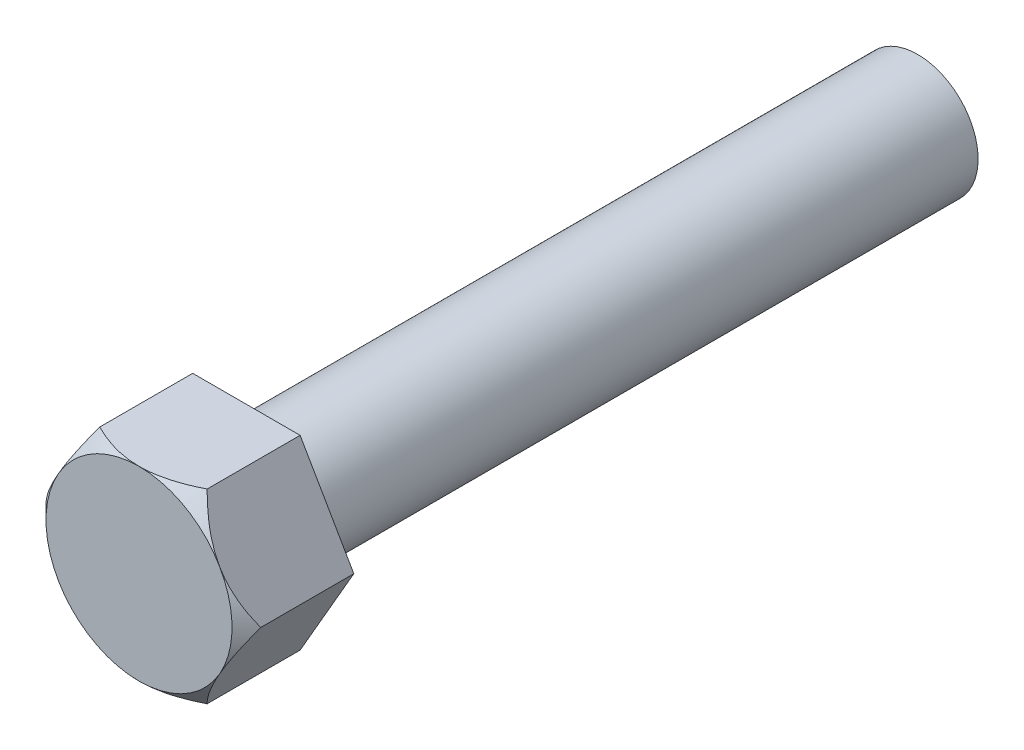
ISO-10303-21;
HEADER;
FILE_DESCRIPTION(('STEP AP214'),'2;1');
FILE_NAME('part.step','',(''),(''),'','','');
FILE_SCHEMA(('AUTOMOTIVE_DESIGN { 1 0 10303 214 1 1 1 1 }'));
ENDSEC;
DATA;
#1=APPLICATION_CONTEXT('core data for automotive mechanical design processes');
#2=APPLICATION_PROTOCOL_DEFINITION('international standard','automotive_design',2000,#1);
#3=PRODUCT_CONTEXT('',#1,'mechanical');
#4=PRODUCT('Part','Part','',(#3));
#5=PRODUCT_RELATED_PRODUCT_CATEGORY('part','',(#4));
#6=PRODUCT_DEFINITION_FORMATION('','',#4);
#7=PRODUCT_DEFINITION_CONTEXT('part definition',#1,'design');
#8=PRODUCT_DEFINITION('design','',#6,#7);
#9=PRODUCT_DEFINITION_SHAPE('','',#8);
#10=(LENGTH_UNIT() NAMED_UNIT(*) SI_UNIT(.MILLI.,.METRE.));
#11=(NAMED_UNIT(*) PLANE_ANGLE_UNIT() SI_UNIT($,.RADIAN.));
#12=(NAMED_UNIT(*) SI_UNIT($,.STERADIAN.) SOLID_ANGLE_UNIT());
#13=UNCERTAINTY_MEASURE_WITH_UNIT(LENGTH_MEASURE(1.E-05),#10,'distance_accuracy_value','');
#14=(GEOMETRIC_REPRESENTATION_CONTEXT(3) GLOBAL_UNCERTAINTY_ASSIGNED_CONTEXT((#13)) GLOBAL_UNIT_ASSIGNED_CONTEXT((#10,
#11,#12)) REPRESENTATION_CONTEXT('',''));
#15=CARTESIAN_POINT('',(0.,0.,0.));
#16=DIRECTION('',(0.,0.,1.));
#17=DIRECTION('',(1.,0.,0.));
#18=AXIS2_PLACEMENT_3D('',#15,#16,#17);
#19=CARTESIAN_POINT('',(2.,3.46410161513775,4.));
#20=DIRECTION('',(0.,-1.,0.));
#21=DIRECTION('',(1.,0.,0.));
#22=AXIS2_PLACEMENT_3D('',#19,#20,#21);
#23=PLANE('',#22);
#24=CARTESIAN_POINT('',(7.40017029938944,3.46410161513776,-0.7067319078246));
#25=CARTESIAN_POINT('',(7.18407004153921,3.46410161513776,-0.511073166536819));
#26=CARTESIAN_POINT('',(6.96725440490175,3.46410161513776,-0.316193765898289));
#27=CARTESIAN_POINT('',(6.53160584662028,3.46410161513776,0.0714200980872705));
#28=CARTESIAN_POINT('',(6.31277237006917,3.46410161513776,0.264153937166413));
#29=CARTESIAN_POINT('',(5.87066754506703,3.46410161513776,0.6484791114294));
#30=CARTESIAN_POINT('',(5.64737403972401,3.46410161513776,0.840045065272859));
#31=CARTESIAN_POINT('',(5.30994288032754,3.46410161513776,1.12439764508569));
#32=CARTESIAN_POINT('',(5.19706079108244,3.46410161513776,1.21867422432068));
#33=CARTESIAN_POINT('',(4.97031249767652,3.46410161513776,1.40605471643436));
#34=CARTESIAN_POINT('',(4.85644621873211,3.46410161513776,1.49915853885661));
#35=CARTESIAN_POINT('',(4.53999649672346,3.46410161513776,1.75469598186242));
#36=CARTESIAN_POINT('',(4.33621461524904,3.46410161513776,1.91565216408102));
#37=CARTESIAN_POINT('',(3.92400046507774,3.46410161513776,2.23149577635638));
#38=CARTESIAN_POINT('',(3.71556886523122,3.46410161513776,2.38638407054125));
#39=CARTESIAN_POINT('',(3.39836320090983,3.46410161513776,2.61194639730746));
#40=CARTESIAN_POINT('',(3.29195681902877,3.46410161513776,2.68594794027607));
#41=CARTESIAN_POINT('',(3.07730373985467,3.46410161513776,2.83122558710456));
#42=CARTESIAN_POINT('',(2.96905718028622,3.46410161513775,2.90250189364354));
#43=CARTESIAN_POINT('',(2.75048301211456,3.46410161513775,3.04165213772647));
#44=CARTESIAN_POINT('',(2.64015671724489,3.46410161513775,3.10952813020775));
#45=CARTESIAN_POINT('',(2.41703261399547,3.46410161513775,3.24107847098912));
#46=CARTESIAN_POINT('',(2.30423515776689,3.46410161513775,3.30475341283555));
#47=CARTESIAN_POINT('',(2.08144977638531,3.46410161513775,3.42380291248049));
#48=CARTESIAN_POINT('',(1.97159887598068,3.46410161513775,3.47943225146873));
#49=CARTESIAN_POINT('',(1.74903913634423,3.46410161513775,3.58472957387611));
#50=CARTESIAN_POINT('',(1.63633007395308,3.46410161513775,3.63439709006196));
#51=CARTESIAN_POINT('',(1.40812138349336,3.46410161513775,3.72619855255872));
#52=CARTESIAN_POINT('',(1.29262797307293,3.46410161513775,3.76834778651596));
#53=CARTESIAN_POINT('',(1.05871802930967,3.46410161513775,3.84351564840573));
#54=CARTESIAN_POINT('',(0.940302975318467,3.46410161513775,3.87653879794917));
#55=CARTESIAN_POINT('',(0.72121858836408,3.46410161513775,3.92704061908541));
#56=CARTESIAN_POINT('',(0.620940075769071,3.46410161513775,3.94620465981961));
#57=CARTESIAN_POINT('',(0.419133847203087,3.46410161513775,3.97616144972208));
#58=CARTESIAN_POINT('',(0.317606311496609,3.46410161513775,3.98695539282922));
#59=CARTESIAN_POINT('',(0.114121574983677,3.46410161513775,3.99960617914009));
#60=CARTESIAN_POINT('',(0.0121651103225236,3.46410161513775,4.00147469928641));
#61=CARTESIAN_POINT('',(-0.191515815212341,3.46410161513775,3.99620425968083));
#62=CARTESIAN_POINT('',(-0.293240265744337,3.46410161513775,3.9890649059828));
#63=CARTESIAN_POINT('',(-0.495218668791278,3.46410161513775,3.96621445225102));
#64=CARTESIAN_POINT('',(-0.595477303913389,3.46410161513775,3.95054410775051));
#65=CARTESIAN_POINT('',(-0.794465835445799,3.46410161513775,3.91140538195982));
#66=CARTESIAN_POINT('',(-0.893195344558054,3.46410161513775,3.88793505782806));
#67=CARTESIAN_POINT('',(-1.08897509907906,3.46410161513775,3.83409029574206));
#68=CARTESIAN_POINT('',(-1.18602099035489,3.46410161513775,3.80370019956214));
#69=CARTESIAN_POINT('',(-1.37804397268214,3.46410161513775,3.7370522437192));
#70=CARTESIAN_POINT('',(-1.47302124517933,3.46410161513775,3.70079490106373));
#71=CARTESIAN_POINT('',(-1.70872144754631,3.46410161513775,3.60365752890821));
#72=CARTESIAN_POINT('',(-1.84814535869977,3.46410161513775,3.53963253554078));
#73=CARTESIAN_POINT('',(-2.12278756270001,3.46410161513775,3.4030645583459));
#74=CARTESIAN_POINT('',(-2.25800324579788,3.46410161513775,3.33051641694664));
#75=CARTESIAN_POINT('',(-2.52505483460592,3.46410161513775,3.17880063044757));
#76=CARTESIAN_POINT('',(-2.6568821804044,3.46410161513775,3.09961803262705));
#77=CARTESIAN_POINT('',(-2.9173827558791,3.46410161513775,2.93631723185955));
#78=CARTESIAN_POINT('',(-3.04605663678762,3.46410161513775,2.85220006035422));
#79=CARTESIAN_POINT('',(-3.30204521029762,3.46410161513775,2.67928053371742));
#80=CARTESIAN_POINT('',(-3.42933422602434,3.46410161513775,2.59044034318988));
#81=CARTESIAN_POINT('',(-3.68170408721134,3.46410161513775,2.40967818295746));
#82=CARTESIAN_POINT('',(-3.80678484434625,3.46410161513775,2.31775609040783));
#83=CARTESIAN_POINT('',(-4.05493698412071,3.46410161513775,2.13157935310613));
#84=CARTESIAN_POINT('',(-4.17801078637578,3.46410161513775,2.03732792478451));
#85=CARTESIAN_POINT('',(-4.42261373513114,3.46410161513775,1.84683880788022));
#86=CARTESIAN_POINT('',(-4.5441428342403,3.46410161513775,1.75060105859423));
#87=CARTESIAN_POINT('',(-4.90254546348755,3.46410161513775,1.46286832216817));
#88=CARTESIAN_POINT('',(-5.13756354076296,3.46410161513775,1.26906294550104));
#89=CARTESIAN_POINT('',(-5.60402824417592,3.46410161513775,0.877051484386474));
#90=CARTESIAN_POINT('',(-5.8354734909006,3.46410161513775,0.678843768902327));
#91=CARTESIAN_POINT('',(-6.29027572717909,3.46410161513775,0.283909712167151));
#92=CARTESIAN_POINT('',(-6.513695740974,3.46410161513775,0.0872558324011803));
#93=CARTESIAN_POINT('',(-6.8472502917772,3.46410161513775,-0.209376727841603));
#94=CARTESIAN_POINT('',(-6.95814443399755,3.46410161513775,-0.308504002622919));
#95=CARTESIAN_POINT('',(-7.17948154981587,3.46410161513775,-0.507258863925652));
#96=CARTESIAN_POINT('',(-7.2899245278921,3.46410161513775,-0.606886445459024));
#97=CARTESIAN_POINT('',(-7.40017029938944,3.46410161513775,-0.706731907824598));
#98=B_SPLINE_CURVE_WITH_KNOTS('',3,(#24,#25,#26,#27,#28,#29,#30,#31,#32,#33,#34,#35,#36,#37,#38,
#39,#40,#41,#42,#43,#44,#45,#46,#47,#48,#49,#50,#51,#52,#53,#54,#55,#56,#57,#58,#59,#60,#61,#62,
#63,#64,#65,#66,#67,#68,#69,#70,#71,#72,#73,#74,#75,#76,#77,#78,#79,#80,#81,#82,#83,#84,#85,#86,
#87,#88,#89,#90,#91,#92,#93,#94,#95,#96,#97),.UNSPECIFIED.,.F.,.F.,(4,2,2,2,2,2,2,2,2,2,2,2,2,2,
2,2,2,2,2,2,2,2,2,2,2,2,2,2,2,2,2,2,2,2,2,2,4),(0.,0.87455680262504,1.74936174189804,
2.63194222676004,3.07315427435045,3.51440014741194,4.29336829879911,5.07222511103335,
5.46102045477179,5.84978682686765,6.23831534622729,6.62678885417829,6.99604619712695,
7.36533246023067,7.73385903857462,8.1022026979964,8.40816764102258,8.71408893214832,
9.01960988308062,9.32514419598646,9.62923151221206,9.93339462822948,10.2382529748776,
10.5430844727596,11.0029359662702,11.463067174876,11.9242648593344,12.385366483791,
12.8509867841538,13.3166256662762,13.7816540114968,14.2466965894055,15.1604736281341,
16.0745950566943,16.9674915730579,17.4137118923893,17.8599277717141),.UNSPECIFIED.);
#99=CARTESIAN_POINT('',(2.,3.46410161513775,3.46410161513776));
#100=VERTEX_POINT('',#99);
#101=CARTESIAN_POINT('',(0.,3.46410161513775,4.));
#102=VERTEX_POINT('',#101);
#103=EDGE_CURVE('E116',#100,#102,#98,.T.);
#104=ORIENTED_EDGE('',*,*,#103,.F.);
#105=DIRECTION('',(0.,0.,-1.));
#106=VECTOR('',#105,1.);
#107=CARTESIAN_POINT('',(2.,3.46410161513775,4.));
#108=LINE('',#107,#106);
#109=CARTESIAN_POINT('',(2.,3.46410161513775,0.));
#110=VERTEX_POINT('',#109);
#111=EDGE_CURVE('E65',#100,#110,#108,.T.);
#112=ORIENTED_EDGE('',*,*,#111,.T.);
#113=DIRECTION('',(-1.,0.,0.));
#114=VECTOR('',#113,1.);
#115=CARTESIAN_POINT('',(2.,3.46410161513775,0.));
#116=LINE('',#115,#114);
#117=CARTESIAN_POINT('',(-2.,3.46410161513775,0.));
#118=VERTEX_POINT('',#117);
#119=EDGE_CURVE('E124',#110,#118,#116,.T.);
#120=ORIENTED_EDGE('',*,*,#119,.T.);
#121=DIRECTION('',(0.,0.,-1.));
#122=VECTOR('',#121,1.);
#123=CARTESIAN_POINT('',(-2.,3.46410161513775,4.));
#124=LINE('',#123,#122);
#125=CARTESIAN_POINT('',(-2.,3.46410161513775,3.46410161513776));
#126=VERTEX_POINT('',#125);
#127=EDGE_CURVE('E142',#126,#118,#124,.T.);
#128=ORIENTED_EDGE('',*,*,#127,.F.);
#129=EDGE_CURVE('E125',#102,#126,#98,.T.);
#130=ORIENTED_EDGE('',*,*,#129,.F.);
#131=EDGE_LOOP('',(#104,#112,#120,#128,#130));
#132=FACE_BOUND('',#131,.T.);
#133=ADVANCED_FACE('F40',(#132),#23,.F.);
#134=CARTESIAN_POINT('',(-2.,3.46410161513775,4.));
#135=DIRECTION('',(0.866025403784439,-0.5,0.));
#136=DIRECTION('',(0.5,0.866025403784439,0.));
#137=AXIS2_PLACEMENT_3D('',#134,#135,#136);
#138=PLANE('',#137);
#139=CARTESIAN_POINT('',(-1.99988452994616,3.46430161513775,3.46398614008406));
#140=CARTESIAN_POINT('',(-2.06863246295732,3.34522670224709,3.53267400421884));
#141=CARTESIAN_POINT('',(-2.13852994001664,3.22416072065947,3.59732758690165));
#142=CARTESIAN_POINT('',(-2.28105847687455,2.97729405329311,3.71570650668545));
#143=CARTESIAN_POINT('',(-2.35370308985488,2.851469892715,3.76936598250564));
#144=CARTESIAN_POINT('',(-2.50018745024056,2.59775153801277,3.86128557885152));
#145=CARTESIAN_POINT('',(-2.57398989649517,2.46992195137692,3.89977672251399));
#146=CARTESIAN_POINT('',(-2.72321949203156,2.21144870991494,3.95908014460861));
#147=CARTESIAN_POINT('',(-2.79864208312694,2.08081295009925,3.97993668783239));
#148=CARTESIAN_POINT('',(-2.92863047900332,1.85566644404698,3.9987548867764));
#149=CARTESIAN_POINT('',(-2.98302842594063,1.76144643612412,4.0015404483458));
#150=CARTESIAN_POINT('',(-3.09173582960688,1.57315968981527,3.99684613324094));
#151=CARTESIAN_POINT('',(-3.14604524863371,1.47909301673127,3.98936265790477));
#152=CARTESIAN_POINT('',(-3.25414955803445,1.29185086033204,3.96455756349842));
#153=CARTESIAN_POINT('',(-3.30794380435859,1.19867649254374,3.94722494046805));
#154=CARTESIAN_POINT('',(-3.41460839868816,1.01392799579621,3.90366758974168));
#155=CARTESIAN_POINT('',(-3.46747881720154,0.922353744713608,3.87744354379729));
#156=CARTESIAN_POINT('',(-3.56133806063717,0.759784766323123,3.82348935231018));
#157=CARTESIAN_POINT('',(-3.60253465928436,0.688430164367164,3.79717760808617));
#158=CARTESIAN_POINT('',(-3.68418827514934,0.5470019530673,3.74031363756192));
#159=CARTESIAN_POINT('',(-3.72464526979475,0.476928382819914,3.7097612820838));
#160=CARTESIAN_POINT('',(-3.80469221784007,0.338283001814588,3.64510103437973));
#161=CARTESIAN_POINT('',(-3.84428444795005,0.269707247679151,3.61100432260174));
#162=CARTESIAN_POINT('',(-3.92273567790658,0.133825731478173,3.53970313630633));
#163=CARTESIAN_POINT('',(-3.96159510997834,0.0665192207766146,3.50250056877247));
#164=CARTESIAN_POINT('',(-4.00011547005384,-0.000200000000000289,3.46398614008406));
#165=B_SPLINE_CURVE_WITH_KNOTS('',3,(#139,#140,#141,#142,#143,#144,#145,#146,#147,#148,#149,
#150,#151,#152,#153,#154,#155,#156,#157,#158,#159,#160,#161,#162,#163,#164),.UNSPECIFIED.,.F.,
.F.,(4,2,2,2,2,2,2,2,2,2,2,2,4),(0.,0.461413976895459,0.925516105496516,1.38224785443131,
1.83782972377834,2.16386281017193,2.49001018016782,2.81652265677474,3.14301010363181,
3.40236585633197,3.66172951128433,3.92029851377053,4.17870990731807),.UNSPECIFIED.);
#166=CARTESIAN_POINT('',(-3.,1.73205080756888,4.));
#167=VERTEX_POINT('',#166);
#168=EDGE_CURVE('E131',#126,#167,#165,.T.);
#169=ORIENTED_EDGE('',*,*,#168,.F.);
#170=ORIENTED_EDGE('',*,*,#127,.T.);
#171=DIRECTION('',(-0.5,-0.866025403784439,0.));
#172=VECTOR('',#171,1.);
#173=CARTESIAN_POINT('',(-2.,3.46410161513775,0.));
#174=LINE('',#173,#172);
#175=CARTESIAN_POINT('',(-4.,0.,0.));
#176=VERTEX_POINT('',#175);
#177=EDGE_CURVE('E290',#118,#176,#174,.T.);
#178=ORIENTED_EDGE('',*,*,#177,.T.);
#179=DIRECTION('',(0.,0.,-1.));
#180=VECTOR('',#179,1.);
#181=CARTESIAN_POINT('',(-4.,0.,4.));
#182=LINE('',#181,#180);
#183=CARTESIAN_POINT('',(-4.,0.,3.46410161513776));
#184=VERTEX_POINT('',#183);
#185=EDGE_CURVE('E217',#184,#176,#182,.T.);
#186=ORIENTED_EDGE('',*,*,#185,.F.);
#187=EDGE_CURVE('E145',#167,#184,#165,.T.);
#188=ORIENTED_EDGE('',*,*,#187,.F.);
#189=EDGE_LOOP('',(#169,#170,#178,#186,#188));
#190=FACE_BOUND('',#189,.T.);
#191=ADVANCED_FACE('F205',(#190),#138,.F.);
#192=CARTESIAN_POINT('',(-4.,0.,4.));
#193=DIRECTION('',(0.866025403784439,0.5,0.));
#194=DIRECTION('',(-0.5,0.866025403784439,0.));
#195=AXIS2_PLACEMENT_3D('',#192,#193,#194);
#196=PLANE('',#195);
#197=CARTESIAN_POINT('',(-4.00011547005384,0.00019999999999938,3.46398614008406));
#198=CARTESIAN_POINT('',(-3.93136753704268,-0.118874912890663,3.53267400421884));
#199=CARTESIAN_POINT('',(-3.86147005998336,-0.239940894478287,3.59732758690165));
#200=CARTESIAN_POINT('',(-3.71894152312545,-0.486807561844643,3.71570650668545));
#201=CARTESIAN_POINT('',(-3.64629691014512,-0.612631722422753,3.76936598250564));
#202=CARTESIAN_POINT('',(-3.49981254975943,-0.866350077124988,3.86128557885152));
#203=CARTESIAN_POINT('',(-3.42601010350483,-0.994179663760835,3.89977672251399));
#204=CARTESIAN_POINT('',(-3.27678050796844,-1.25265290522282,3.95908014460861));
#205=CARTESIAN_POINT('',(-3.20135791687306,-1.38328866503851,3.97993668783239));
#206=CARTESIAN_POINT('',(-3.07136952099668,-1.60843517109077,3.9987548867764));
#207=CARTESIAN_POINT('',(-3.01697157405937,-1.70265517901363,4.0015404483458));
#208=CARTESIAN_POINT('',(-2.90826417039312,-1.89094192532248,3.99684613324094));
#209=CARTESIAN_POINT('',(-2.85395475136629,-1.98500859840649,3.98936265790477));
#210=CARTESIAN_POINT('',(-2.74585044196555,-2.17225075480571,3.96455756349842));
#211=CARTESIAN_POINT('',(-2.69205619564141,-2.26542512259401,3.94722494046805));
#212=CARTESIAN_POINT('',(-2.58539160131184,-2.45017361934154,3.90366758974167));
#213=CARTESIAN_POINT('',(-2.53252118279846,-2.54174787042414,3.87744354379729));
#214=CARTESIAN_POINT('',(-2.43866193936283,-2.70431684881463,3.82348935231018));
#215=CARTESIAN_POINT('',(-2.39746534071564,-2.77567145077059,3.79717760808618));
#216=CARTESIAN_POINT('',(-2.31581172485066,-2.91709966207045,3.74031363756192));
#217=CARTESIAN_POINT('',(-2.27535473020525,-2.98717323231784,3.7097612820838));
#218=CARTESIAN_POINT('',(-2.19530778215993,-3.12581861332317,3.64510103437973));
#219=CARTESIAN_POINT('',(-2.15571555204995,-3.1943943674586,3.61100432260173));
#220=CARTESIAN_POINT('',(-2.07726432209342,-3.33027588365958,3.53970313630632));
#221=CARTESIAN_POINT('',(-2.03840489002166,-3.39758239436114,3.50250056877247));
#222=CARTESIAN_POINT('',(-1.99988452994616,-3.46430161513776,3.46398614008406));
#223=B_SPLINE_CURVE_WITH_KNOTS('',3,(#197,#198,#199,#200,#201,#202,#203,#204,#205,#206,#207,
#208,#209,#210,#211,#212,#213,#214,#215,#216,#217,#218,#219,#220,#221,#222),.UNSPECIFIED.,.F.,
.F.,(4,2,2,2,2,2,2,2,2,2,2,2,4),(0.,0.46141397689546,0.925516105496516,1.38224785443131,
1.83782972377834,2.16386281017193,2.49001018016782,2.81652265677474,3.14301010363181,
3.40236585633197,3.66172951128433,3.92029851377053,4.17870990731808),.UNSPECIFIED.);
#224=CARTESIAN_POINT('',(-3.,-1.73205080756888,4.));
#225=VERTEX_POINT('',#224);
#226=EDGE_CURVE('E199',#184,#225,#223,.T.);
#227=ORIENTED_EDGE('',*,*,#226,.F.);
#228=ORIENTED_EDGE('',*,*,#185,.T.);
#229=DIRECTION('',(0.5,-0.866025403784439,0.));
#230=VECTOR('',#229,1.);
#231=CARTESIAN_POINT('',(-4.,0.,0.));
#232=LINE('',#231,#230);
#233=CARTESIAN_POINT('',(-2.,-3.46410161513776,0.));
#234=VERTEX_POINT('',#233);
#235=EDGE_CURVE('E239',#176,#234,#232,.T.);
#236=ORIENTED_EDGE('',*,*,#235,.T.);
#237=DIRECTION('',(0.,0.,-1.));
#238=VECTOR('',#237,1.);
#239=CARTESIAN_POINT('',(-2.,-3.46410161513776,4.));
#240=LINE('',#239,#238);
#241=CARTESIAN_POINT('',(-2.00000000000003,-3.46410161513776,3.46410161513776));
#242=VERTEX_POINT('',#241);
#243=EDGE_CURVE('E237',#242,#234,#240,.T.);
#244=ORIENTED_EDGE('',*,*,#243,.F.);
#245=EDGE_CURVE('E192',#225,#242,#223,.T.);
#246=ORIENTED_EDGE('',*,*,#245,.F.);
#247=EDGE_LOOP('',(#227,#228,#236,#244,#246));
#248=FACE_BOUND('',#247,.T.);
#249=ADVANCED_FACE('F201',(#248),#196,.F.);
#250=CARTESIAN_POINT('',(-2.,-3.46410161513776,4.));
#251=DIRECTION('',(0.,1.,0.));
#252=DIRECTION('',(-1.,0.,0.));
#253=AXIS2_PLACEMENT_3D('',#250,#251,#252);
#254=PLANE('',#253);
#255=CARTESIAN_POINT('',(-7.40017029938944,-3.46410161513776,-0.706731907824597));
#256=CARTESIAN_POINT('',(-7.18407004153921,-3.46410161513776,-0.511073166536817));
#257=CARTESIAN_POINT('',(-6.96725440490175,-3.46410161513776,-0.316193765898287));
#258=CARTESIAN_POINT('',(-6.53160584662028,-3.46410161513776,0.0714200980872724));
#259=CARTESIAN_POINT('',(-6.31277237006917,-3.46410161513776,0.264153937166415));
#260=CARTESIAN_POINT('',(-5.87066754506702,-3.46410161513776,0.648479111429401));
#261=CARTESIAN_POINT('',(-5.64737403972401,-3.46410161513776,0.84004506527286));
#262=CARTESIAN_POINT('',(-5.30994288032754,-3.46410161513776,1.12439764508569));
#263=CARTESIAN_POINT('',(-5.19706079108244,-3.46410161513776,1.21867422432069));
#264=CARTESIAN_POINT('',(-4.97031249767652,-3.46410161513776,1.40605471643437));
#265=CARTESIAN_POINT('',(-4.85644621873211,-3.46410161513776,1.49915853885661));
#266=CARTESIAN_POINT('',(-4.53999649672346,-3.46410161513776,1.75469598186242));
#267=CARTESIAN_POINT('',(-4.33621461524904,-3.46410161513776,1.91565216408103));
#268=CARTESIAN_POINT('',(-3.92400046507774,-3.46410161513776,2.23149577635638));
#269=CARTESIAN_POINT('',(-3.71556886523122,-3.46410161513776,2.38638407054125));
#270=CARTESIAN_POINT('',(-3.39836320090983,-3.46410161513776,2.61194639730746));
#271=CARTESIAN_POINT('',(-3.29195681902876,-3.46410161513776,2.68594794027607));
#272=CARTESIAN_POINT('',(-3.07730373985467,-3.46410161513776,2.83122558710456));
#273=CARTESIAN_POINT('',(-2.96905718028622,-3.46410161513776,2.90250189364354));
#274=CARTESIAN_POINT('',(-2.75048301211455,-3.46410161513776,3.04165213772647));
#275=CARTESIAN_POINT('',(-2.64015671724488,-3.46410161513776,3.10952813020775));
#276=CARTESIAN_POINT('',(-2.41703261399546,-3.46410161513776,3.24107847098912));
#277=CARTESIAN_POINT('',(-2.30423515776688,-3.46410161513776,3.30475341283555));
#278=CARTESIAN_POINT('',(-2.08144977638531,-3.46410161513776,3.4238029124805));
#279=CARTESIAN_POINT('',(-1.97159887598068,-3.46410161513776,3.47943225146873));
#280=CARTESIAN_POINT('',(-1.74903913634422,-3.46410161513776,3.58472957387611));
#281=CARTESIAN_POINT('',(-1.63633007395308,-3.46410161513776,3.63439709006196));
#282=CARTESIAN_POINT('',(-1.40812138349335,-3.46410161513776,3.72619855255872));
#283=CARTESIAN_POINT('',(-1.29262797307292,-3.46410161513776,3.76834778651596));
#284=CARTESIAN_POINT('',(-1.05871802930966,-3.46410161513776,3.84351564840573));
#285=CARTESIAN_POINT('',(-0.940302975318459,-3.46410161513776,3.87653879794917));
#286=CARTESIAN_POINT('',(-0.721218588364073,-3.46410161513776,3.92704061908541));
#287=CARTESIAN_POINT('',(-0.620940075769063,-3.46410161513776,3.94620465981961));
#288=CARTESIAN_POINT('',(-0.41913384720308,-3.46410161513776,3.97616144972208));
#289=CARTESIAN_POINT('',(-0.317606311496602,-3.46410161513776,3.98695539282922));
#290=CARTESIAN_POINT('',(-0.11412157498367,-3.46410161513776,3.99960617914009));
#291=CARTESIAN_POINT('',(-0.0121651103225156,-3.46410161513776,4.0014746992864));
#292=CARTESIAN_POINT('',(0.191515815212349,-3.46410161513776,3.99620425968083));
#293=CARTESIAN_POINT('',(0.293240265744345,-3.46410161513776,3.98906490598279));
#294=CARTESIAN_POINT('',(0.495218668791286,-3.46410161513776,3.96621445225101));
#295=CARTESIAN_POINT('',(0.595477303913397,-3.46410161513776,3.95054410775051));
#296=CARTESIAN_POINT('',(0.794465835445807,-3.46410161513776,3.91140538195982));
#297=CARTESIAN_POINT('',(0.893195344558063,-3.46410161513776,3.88793505782805));
#298=CARTESIAN_POINT('',(1.08897509907907,-3.46410161513776,3.83409029574205));
#299=CARTESIAN_POINT('',(1.1860209903549,-3.46410161513776,3.80370019956214));
#300=CARTESIAN_POINT('',(1.37804397268215,-3.46410161513776,3.73705224371919));
#301=CARTESIAN_POINT('',(1.47302124517934,-3.46410161513776,3.70079490106372));
#302=CARTESIAN_POINT('',(1.70872144754632,-3.46410161513776,3.6036575289082));
#303=CARTESIAN_POINT('',(1.84814535869978,-3.46410161513776,3.53963253554077));
#304=CARTESIAN_POINT('',(2.12278756270002,-3.46410161513776,3.40306455834589));
#305=CARTESIAN_POINT('',(2.25800324579789,-3.46410161513776,3.33051641694663));
#306=CARTESIAN_POINT('',(2.52505483460593,-3.46410161513776,3.17880063044756));
#307=CARTESIAN_POINT('',(2.65688218040442,-3.46410161513776,3.09961803262704));
#308=CARTESIAN_POINT('',(2.91738275587911,-3.46410161513776,2.93631723185954));
#309=CARTESIAN_POINT('',(3.04605663678764,-3.46410161513776,2.85220006035421));
#310=CARTESIAN_POINT('',(3.30204521029764,-3.46410161513776,2.6792805337174));
#311=CARTESIAN_POINT('',(3.42933422602436,-3.46410161513776,2.59044034318987));
#312=CARTESIAN_POINT('',(3.68170408721136,-3.46410161513776,2.40967818295744));
#313=CARTESIAN_POINT('',(3.80678484434628,-3.46410161513776,2.31775609040781));
#314=CARTESIAN_POINT('',(4.05493698412073,-3.46410161513776,2.13157935310611));
#315=CARTESIAN_POINT('',(4.1780107863758,-3.46410161513776,2.03732792478449));
#316=CARTESIAN_POINT('',(4.42261373513117,-3.46410161513776,1.8468388078802));
#317=CARTESIAN_POINT('',(4.54414283424033,-3.46410161513776,1.75060105859421));
#318=CARTESIAN_POINT('',(4.90254546348757,-3.46410161513776,1.46286832216815));
#319=CARTESIAN_POINT('',(5.13756354076298,-3.46410161513776,1.26906294550102));
#320=CARTESIAN_POINT('',(5.60402824417593,-3.46410161513776,0.877051484386461));
#321=CARTESIAN_POINT('',(5.83547349090062,-3.46410161513776,0.678843768902316));
#322=CARTESIAN_POINT('',(6.2902757271791,-3.46410161513776,0.283909712167142));
#323=CARTESIAN_POINT('',(6.513695740974,-3.46410161513776,0.0872558324011722));
#324=CARTESIAN_POINT('',(6.8472502917772,-3.46410161513776,-0.209376727841608));
#325=CARTESIAN_POINT('',(6.95814443399756,-3.46410161513775,-0.308504002622922));
#326=CARTESIAN_POINT('',(7.17948154981587,-3.46410161513775,-0.507258863925652));
#327=CARTESIAN_POINT('',(7.2899245278921,-3.46410161513775,-0.606886445459023));
#328=CARTESIAN_POINT('',(7.40017029938944,-3.46410161513775,-0.706731907824597));
#329=B_SPLINE_CURVE_WITH_KNOTS('',3,(#255,#256,#257,#258,#259,#260,#261,#262,#263,#264,#265,
#266,#267,#268,#269,#270,#271,#272,#273,#274,#275,#276,#277,#278,#279,#280,#281,#282,#283,#284,
#285,#286,#287,#288,#289,#290,#291,#292,#293,#294,#295,#296,#297,#298,#299,#300,#301,#302,#303,
#304,#305,#306,#307,#308,#309,#310,#311,#312,#313,#314,#315,#316,#317,#318,#319,#320,#321,#322,
#323,#324,#325,#326,#327,#328),.UNSPECIFIED.,.F.,.F.,(4,2,2,2,2,2,2,2,2,2,2,2,2,2,2,2,2,2,2,2,2,
2,2,2,2,2,2,2,2,2,2,2,2,2,2,2,4),(0.,0.87455680262504,1.74936174189804,2.63194222676004,
3.07315427435045,3.51440014741194,4.29336829879911,5.07222511103335,5.46102045477179,
5.84978682686765,6.23831534622729,6.62678885417829,6.99604619712695,7.36533246023067,
7.73385903857462,8.1022026979964,8.40816764102258,8.71408893214832,9.01960988308062,
9.32514419598646,9.62923151221206,9.93339462822948,10.2382529748776,10.5430844727596,
11.0029359662702,11.463067174876,11.9242648593344,12.385366483791,12.8509867841538,
13.3166256662763,13.7816540114968,14.2466965894055,15.1604736281341,16.0745950566943,
16.9674915730579,17.4137118923893,17.8599277717141),.UNSPECIFIED.);
#330=CARTESIAN_POINT('',(0.,-3.46410161513775,4.));
#331=VERTEX_POINT('',#330);
#332=EDGE_CURVE('E200',#242,#331,#329,.T.);
#333=ORIENTED_EDGE('',*,*,#332,.F.);
#334=ORIENTED_EDGE('',*,*,#243,.T.);
#335=DIRECTION('',(1.,0.,0.));
#336=VECTOR('',#335,1.);
#337=CARTESIAN_POINT('',(-2.,-3.46410161513776,0.));
#338=LINE('',#337,#336);
#339=CARTESIAN_POINT('',(2.,-3.46410161513776,0.));
#340=VERTEX_POINT('',#339);
#341=EDGE_CURVE('E294',#234,#340,#338,.T.);
#342=ORIENTED_EDGE('',*,*,#341,.T.);
#343=DIRECTION('',(0.,0.,-1.));
#344=VECTOR('',#343,1.);
#345=CARTESIAN_POINT('',(2.,-3.46410161513776,4.));
#346=LINE('',#345,#344);
#347=CARTESIAN_POINT('',(2.,-3.46410161513776,3.46410161513776));
#348=VERTEX_POINT('',#347);
#349=EDGE_CURVE('E244',#348,#340,#346,.T.);
#350=ORIENTED_EDGE('',*,*,#349,.F.);
#351=EDGE_CURVE('E186',#331,#348,#329,.T.);
#352=ORIENTED_EDGE('',*,*,#351,.F.);
#353=EDGE_LOOP('',(#333,#334,#342,#350,#352));
#354=FACE_BOUND('',#353,.T.);
#355=ADVANCED_FACE('F204',(#354),#254,.F.);
#356=CARTESIAN_POINT('',(2.,-3.46410161513776,4.));
#357=DIRECTION('',(-0.866025403784439,0.5,0.));
#358=DIRECTION('',(-0.5,-0.866025403784439,0.));
#359=AXIS2_PLACEMENT_3D('',#356,#357,#358);
#360=PLANE('',#359);
#361=CARTESIAN_POINT('',(1.99988452994616,-3.46430161513776,3.46398614008406));
#362=CARTESIAN_POINT('',(2.06863246295732,-3.34522670224709,3.53267400421883));
#363=CARTESIAN_POINT('',(2.13852994001664,-3.22416072065947,3.59732758690165));
#364=CARTESIAN_POINT('',(2.28105847687455,-2.97729405329311,3.71570650668545));
#365=CARTESIAN_POINT('',(2.35370308985488,-2.851469892715,3.76936598250564));
#366=CARTESIAN_POINT('',(2.50018745024057,-2.59775153801277,3.86128557885152));
#367=CARTESIAN_POINT('',(2.57398989649517,-2.46992195137692,3.89977672251399));
#368=CARTESIAN_POINT('',(2.72321949203156,-2.21144870991494,3.95908014460861));
#369=CARTESIAN_POINT('',(2.79864208312694,-2.08081295009925,3.97993668783239));
#370=CARTESIAN_POINT('',(2.92863047900332,-1.85566644404699,3.99875488677639));
#371=CARTESIAN_POINT('',(2.98302842594063,-1.76144643612412,4.0015404483458));
#372=CARTESIAN_POINT('',(3.09173582960688,-1.57315968981527,3.99684613324094));
#373=CARTESIAN_POINT('',(3.14604524863371,-1.47909301673127,3.98936265790477));
#374=CARTESIAN_POINT('',(3.25414955803445,-1.29185086033204,3.96455756349842));
#375=CARTESIAN_POINT('',(3.30794380435859,-1.19867649254375,3.94722494046805));
#376=CARTESIAN_POINT('',(3.41460839868816,-1.01392799579621,3.90366758974167));
#377=CARTESIAN_POINT('',(3.46747881720154,-0.922353744713609,3.87744354379729));
#378=CARTESIAN_POINT('',(3.56133806063717,-0.759784766323123,3.82348935231018));
#379=CARTESIAN_POINT('',(3.60253465928436,-0.688430164367164,3.79717760808617));
#380=CARTESIAN_POINT('',(3.68418827514934,-0.547001953067301,3.74031363756192));
#381=CARTESIAN_POINT('',(3.72464526979475,-0.476928382819915,3.7097612820838));
#382=CARTESIAN_POINT('',(3.80469221784007,-0.338283001814589,3.64510103437973));
#383=CARTESIAN_POINT('',(3.84428444795005,-0.269707247679152,3.61100432260173));
#384=CARTESIAN_POINT('',(3.92273567790658,-0.133825731478174,3.53970313630632));
#385=CARTESIAN_POINT('',(3.96159510997834,-0.0665192207766148,3.50250056877247));
#386=CARTESIAN_POINT('',(4.00011547005384,0.000200000000000174,3.46398614008406));
#387=B_SPLINE_CURVE_WITH_KNOTS('',3,(#361,#362,#363,#364,#365,#366,#367,#368,#369,#370,#371,
#372,#373,#374,#375,#376,#377,#378,#379,#380,#381,#382,#383,#384,#385,#386),.UNSPECIFIED.,.F.,
.F.,(4,2,2,2,2,2,2,2,2,2,2,2,4),(0.,0.46141397689546,0.925516105496517,1.38224785443131,
1.83782972377834,2.16386281017194,2.49001018016783,2.81652265677474,3.14301010363181,
3.40236585633198,3.66172951128433,3.92029851377053,4.17870990731808),.UNSPECIFIED.);
#388=CARTESIAN_POINT('',(3.,-1.73205080756888,4.));
#389=VERTEX_POINT('',#388);
#390=EDGE_CURVE('E261',#348,#389,#387,.T.);
#391=ORIENTED_EDGE('',*,*,#390,.F.);
#392=ORIENTED_EDGE('',*,*,#349,.T.);
#393=DIRECTION('',(0.5,0.866025403784439,0.));
#394=VECTOR('',#393,1.);
#395=CARTESIAN_POINT('',(2.,-3.46410161513776,0.));
#396=LINE('',#395,#394);
#397=CARTESIAN_POINT('',(4.,0.,0.));
#398=VERTEX_POINT('',#397);
#399=EDGE_CURVE('E299',#340,#398,#396,.T.);
#400=ORIENTED_EDGE('',*,*,#399,.T.);
#401=DIRECTION('',(0.,0.,-1.));
#402=VECTOR('',#401,1.);
#403=CARTESIAN_POINT('',(4.,0.,4.));
#404=LINE('',#403,#402);
#405=CARTESIAN_POINT('',(4.,0.,3.46410161513776));
#406=VERTEX_POINT('',#405);
#407=EDGE_CURVE('E249',#406,#398,#404,.T.);
#408=ORIENTED_EDGE('',*,*,#407,.F.);
#409=EDGE_CURVE('E179',#389,#406,#387,.T.);
#410=ORIENTED_EDGE('',*,*,#409,.F.);
#411=EDGE_LOOP('',(#391,#392,#400,#408,#410));
#412=FACE_BOUND('',#411,.T.);
#413=ADVANCED_FACE('F260',(#412),#360,.F.);
#414=CARTESIAN_POINT('',(4.,0.,4.));
#415=DIRECTION('',(-0.866025403784439,-0.5,0.));
#416=DIRECTION('',(0.5,-0.866025403784438,0.));
#417=AXIS2_PLACEMENT_3D('',#414,#415,#416);
#418=PLANE('',#417);
#419=CARTESIAN_POINT('',(4.00011547005384,-0.000200000000000067,3.46398614008406));
#420=CARTESIAN_POINT('',(3.93136753704268,0.118874912890663,3.53267400421883));
#421=CARTESIAN_POINT('',(3.86147005998336,0.239940894478286,3.59732758690165));
#422=CARTESIAN_POINT('',(3.71894152312545,0.486807561844642,3.71570650668545));
#423=CARTESIAN_POINT('',(3.64629691014512,0.612631722422753,3.76936598250564));
#424=CARTESIAN_POINT('',(3.49981254975944,0.866350077124988,3.86128557885152));
#425=CARTESIAN_POINT('',(3.42601010350483,0.994179663760835,3.89977672251399));
#426=CARTESIAN_POINT('',(3.27678050796844,1.25265290522282,3.95908014460861));
#427=CARTESIAN_POINT('',(3.20135791687306,1.38328866503851,3.97993668783239));
#428=CARTESIAN_POINT('',(3.07136952099668,1.60843517109077,3.9987548867764));
#429=CARTESIAN_POINT('',(3.01697157405937,1.70265517901363,4.0015404483458));
#430=CARTESIAN_POINT('',(2.90826417039312,1.89094192532248,3.99684613324094));
#431=CARTESIAN_POINT('',(2.85395475136629,1.98500859840649,3.98936265790477));
#432=CARTESIAN_POINT('',(2.74585044196555,2.17225075480572,3.96455756349842));
#433=CARTESIAN_POINT('',(2.69205619564141,2.26542512259401,3.94722494046805));
#434=CARTESIAN_POINT('',(2.58539160131184,2.45017361934154,3.90366758974167));
#435=CARTESIAN_POINT('',(2.53252118279846,2.54174787042415,3.87744354379729));
#436=CARTESIAN_POINT('',(2.43866193936283,2.70431684881463,3.82348935231018));
#437=CARTESIAN_POINT('',(2.39746534071564,2.77567145077059,3.79717760808617));
#438=CARTESIAN_POINT('',(2.31581172485066,2.91709966207045,3.74031363756192));
#439=CARTESIAN_POINT('',(2.27535473020525,2.98717323231784,3.7097612820838));
#440=CARTESIAN_POINT('',(2.19530778215993,3.12581861332317,3.64510103437973));
#441=CARTESIAN_POINT('',(2.15571555204995,3.1943943674586,3.61100432260173));
#442=CARTESIAN_POINT('',(2.07726432209342,3.33027588365958,3.53970313630632));
#443=CARTESIAN_POINT('',(2.03840489002166,3.39758239436114,3.50250056877247));
#444=CARTESIAN_POINT('',(1.99988452994616,3.46430161513776,3.46398614008406));
#445=B_SPLINE_CURVE_WITH_KNOTS('',3,(#419,#420,#421,#422,#423,#424,#425,#426,#427,#428,#429,
#430,#431,#432,#433,#434,#435,#436,#437,#438,#439,#440,#441,#442,#443,#444),.UNSPECIFIED.,.F.,
.F.,(4,2,2,2,2,2,2,2,2,2,2,2,4),(0.,0.46141397689546,0.925516105496516,1.38224785443131,
1.83782972377834,2.16386281017194,2.49001018016783,2.81652265677474,3.14301010363181,
3.40236585633197,3.66172951128433,3.92029851377053,4.17870990731808),.UNSPECIFIED.);
#446=CARTESIAN_POINT('',(3.,1.73205080756888,4.));
#447=VERTEX_POINT('',#446);
#448=EDGE_CURVE('E267',#406,#447,#445,.T.);
#449=ORIENTED_EDGE('',*,*,#448,.F.);
#450=ORIENTED_EDGE('',*,*,#407,.T.);
#451=DIRECTION('',(-0.5,0.866025403784438,0.));
#452=VECTOR('',#451,1.);
#453=CARTESIAN_POINT('',(4.,0.,0.));
#454=LINE('',#453,#452);
#455=EDGE_CURVE('E289',#398,#110,#454,.T.);
#456=ORIENTED_EDGE('',*,*,#455,.T.);
#457=ORIENTED_EDGE('',*,*,#111,.F.);
#458=EDGE_CURVE('E121',#447,#100,#445,.T.);
#459=ORIENTED_EDGE('',*,*,#458,.F.);
#460=EDGE_LOOP('',(#449,#450,#456,#457,#459));
#461=FACE_BOUND('',#460,.T.);
#462=ADVANCED_FACE('F285',(#461),#418,.F.);
#463=CARTESIAN_POINT('',(0.,0.,0.));
#464=DIRECTION('',(0.,0.,1.));
#465=DIRECTION('',(1.,0.,0.));
#466=AXIS2_PLACEMENT_3D('',#463,#464,#465);
#467=PLANE('',#466);
#468=CARTESIAN_POINT('',(0.,0.,0.));
#469=DIRECTION('',(0.,0.,-1.));
#470=DIRECTION('',(-1.,0.,0.));
#471=AXIS2_PLACEMENT_3D('',#468,#469,#470);
#472=CIRCLE('',#471,2.25);
#473=CARTESIAN_POINT('',(-2.25,0.,0.));
#474=VERTEX_POINT('',#473);
#475=EDGE_CURVE('E12',#474,#474,#472,.T.);
#476=ORIENTED_EDGE('',*,*,#475,.F.);
#477=EDGE_LOOP('',(#476));
#478=FACE_BOUND('',#477,.T.);
#479=ORIENTED_EDGE('',*,*,#119,.F.);
#480=ORIENTED_EDGE('',*,*,#455,.F.);
#481=ORIENTED_EDGE('',*,*,#399,.F.);
#482=ORIENTED_EDGE('',*,*,#341,.F.);
#483=ORIENTED_EDGE('',*,*,#235,.F.);
#484=ORIENTED_EDGE('',*,*,#177,.F.);
#485=EDGE_LOOP('',(#479,#480,#481,#482,#483,#484));
#486=FACE_BOUND('',#485,.T.);
#487=ADVANCED_FACE('F282',(#478,#486),#467,.F.);
#488=CARTESIAN_POINT('',(0.,0.,4.));
#489=DIRECTION('',(0.,0.,-1.));
#490=DIRECTION('',(1.,0.,0.));
#491=AXIS2_PLACEMENT_3D('',#488,#489,#490);
#492=CONICAL_SURFACE('',#491,3.46410161513775,0.78539816339745);
#493=ORIENTED_EDGE('',*,*,#409,.T.);
#494=ORIENTED_EDGE('',*,*,#448,.T.);
#495=CARTESIAN_POINT('',(0.,0.,4.));
#496=DIRECTION('',(0.,0.,1.));
#497=DIRECTION('',(1.,0.,0.));
#498=AXIS2_PLACEMENT_3D('',#495,#496,#497);
#499=CIRCLE('',#498,3.46410161513775);
#500=EDGE_CURVE('E44',#389,#447,#499,.T.);
#501=ORIENTED_EDGE('',*,*,#500,.F.);
#502=EDGE_LOOP('',(#493,#494,#501));
#503=FACE_BOUND('',#502,.T.);
#504=ADVANCED_FACE('F163',(#503),#492,.T.);
#505=ORIENTED_EDGE('',*,*,#351,.T.);
#506=ORIENTED_EDGE('',*,*,#390,.T.);
#507=EDGE_CURVE('E233',#331,#389,#499,.T.);
#508=ORIENTED_EDGE('',*,*,#507,.F.);
#509=EDGE_LOOP('',(#505,#506,#508));
#510=FACE_BOUND('',#509,.T.);
#511=ADVANCED_FACE('F309',(#510),#492,.T.);
#512=ORIENTED_EDGE('',*,*,#245,.T.);
#513=ORIENTED_EDGE('',*,*,#332,.T.);
#514=EDGE_CURVE('E227',#225,#331,#499,.T.);
#515=ORIENTED_EDGE('',*,*,#514,.F.);
#516=EDGE_LOOP('',(#512,#513,#515));
#517=FACE_BOUND('',#516,.T.);
#518=ADVANCED_FACE('F228',(#517),#492,.T.);
#519=ORIENTED_EDGE('',*,*,#187,.T.);
#520=ORIENTED_EDGE('',*,*,#226,.T.);
#521=EDGE_CURVE('E136',#167,#225,#499,.T.);
#522=ORIENTED_EDGE('',*,*,#521,.F.);
#523=EDGE_LOOP('',(#519,#520,#522));
#524=FACE_BOUND('',#523,.T.);
#525=ADVANCED_FACE('F223',(#524),#492,.T.);
#526=ORIENTED_EDGE('',*,*,#129,.T.);
#527=ORIENTED_EDGE('',*,*,#168,.T.);
#528=EDGE_CURVE('E50',#102,#167,#499,.T.);
#529=ORIENTED_EDGE('',*,*,#528,.F.);
#530=EDGE_LOOP('',(#526,#527,#529));
#531=FACE_BOUND('',#530,.T.);
#532=ADVANCED_FACE('F129',(#531),#492,.T.);
#533=ORIENTED_EDGE('',*,*,#103,.T.);
#534=CARTESIAN_POINT('',(0.,0.,4.));
#535=DIRECTION('',(0.,0.,1.));
#536=DIRECTION('',(1.,0.,0.));
#537=AXIS2_PLACEMENT_3D('',#534,#535,#536);
#538=CIRCLE('',#537,3.46410161513775);
#539=EDGE_CURVE('E119',#447,#102,#538,.T.);
#540=ORIENTED_EDGE('',*,*,#539,.F.);
#541=ORIENTED_EDGE('',*,*,#458,.T.);
#542=EDGE_LOOP('',(#533,#540,#541));
#543=FACE_BOUND('',#542,.T.);
#544=ADVANCED_FACE('F118',(#543),#492,.T.);
#545=CARTESIAN_POINT('',(0.,0.,4.));
#546=DIRECTION('',(0.,0.,1.));
#547=DIRECTION('',(1.,0.,0.));
#548=AXIS2_PLACEMENT_3D('',#545,#546,#547);
#549=PLANE('',#548);
#550=ORIENTED_EDGE('',*,*,#500,.T.);
#551=ORIENTED_EDGE('',*,*,#539,.T.);
#552=ORIENTED_EDGE('',*,*,#528,.T.);
#553=ORIENTED_EDGE('',*,*,#521,.T.);
#554=ORIENTED_EDGE('',*,*,#514,.T.);
#555=ORIENTED_EDGE('',*,*,#507,.T.);
#556=EDGE_LOOP('',(#550,#551,#552,#553,#554,#555));
#557=FACE_BOUND('',#556,.T.);
#558=ADVANCED_FACE('F137',(#557),#549,.T.);
#559=CARTESIAN_POINT('',(0.,0.,-25.));
#560=DIRECTION('',(0.,0.,1.));
#561=DIRECTION('',(1.,0.,0.));
#562=AXIS2_PLACEMENT_3D('',#559,#560,#561);
#563=CYLINDRICAL_SURFACE('',#562,2.25);
#564=CARTESIAN_POINT('',(0.,0.,-25.));
#565=DIRECTION('',(0.,0.,-1.));
#566=DIRECTION('',(-1.,0.,0.));
#567=AXIS2_PLACEMENT_3D('',#564,#565,#566);
#568=CIRCLE('',#567,2.25);
#569=CARTESIAN_POINT('',(-2.25,0.,-25.));
#570=VERTEX_POINT('',#569);
#571=EDGE_CURVE('E139',#570,#570,#568,.T.);
#572=ORIENTED_EDGE('',*,*,#571,.F.);
#573=EDGE_LOOP('',(#572));
#574=FACE_BOUND('',#573,.T.);
#575=ORIENTED_EDGE('',*,*,#475,.T.);
#576=EDGE_LOOP('',(#575));
#577=FACE_BOUND('',#576,.T.);
#578=ADVANCED_FACE('F164',(#574,#577),#563,.T.);
#579=CARTESIAN_POINT('',(0.,0.,-25.));
#580=DIRECTION('',(0.,0.,-1.));
#581=DIRECTION('',(-1.,0.,0.));
#582=AXIS2_PLACEMENT_3D('',#579,#580,#581);
#583=PLANE('',#582);
#584=ORIENTED_EDGE('',*,*,#571,.T.);
#585=EDGE_LOOP('',(#584));
#586=FACE_BOUND('',#585,.T.);
#587=ADVANCED_FACE('F276',(#586),#583,.T.);
#588=CLOSED_SHELL('',(#133,#191,#249,#355,#413,#462,#487,#504,#511,#518,#525,#532,#544,#558,
#578,#587));
#589=MANIFOLD_SOLID_BREP('B2',#588);
#590=ADVANCED_BREP_SHAPE_REPRESENTATION('',(#18,#589),#14);
#591=SHAPE_DEFINITION_REPRESENTATION(#9,#590);
ENDSEC;
END-ISO-10303-21;
